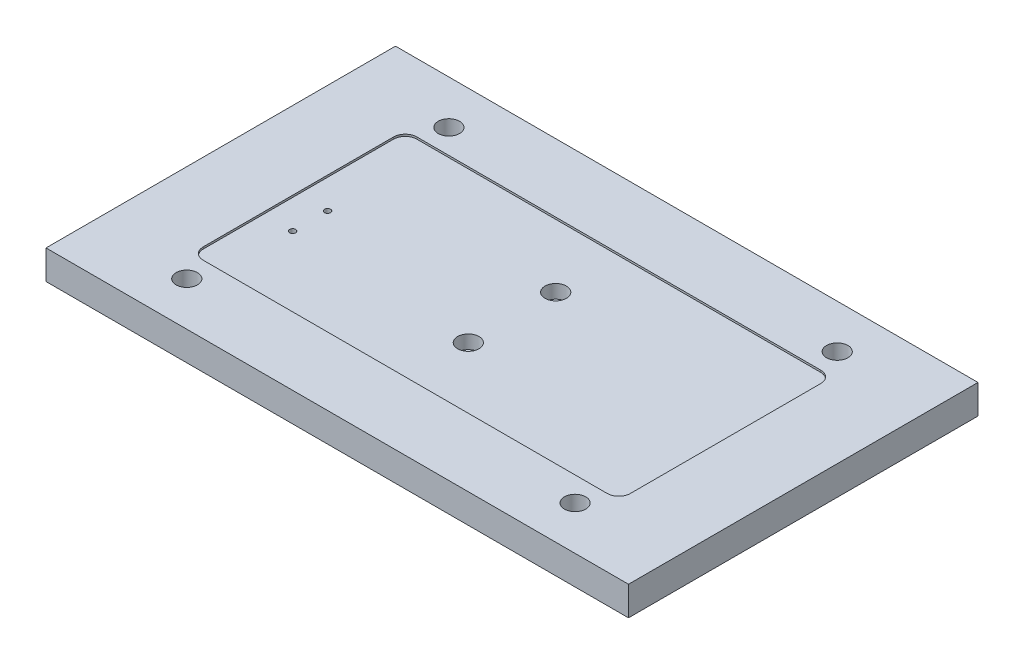
ISO-10303-21;
HEADER;
FILE_DESCRIPTION(('STEP AP214'),'2;1');
FILE_NAME('part.step','',(''),(''),'','','');
FILE_SCHEMA(('AUTOMOTIVE_DESIGN { 1 0 10303 214 1 1 1 1 }'));
ENDSEC;
DATA;
#1=APPLICATION_CONTEXT('core data for automotive mechanical design processes');
#2=APPLICATION_PROTOCOL_DEFINITION('international standard','automotive_design',2000,#1);
#3=PRODUCT_CONTEXT('',#1,'mechanical');
#4=PRODUCT('Part','Part','',(#3));
#5=PRODUCT_RELATED_PRODUCT_CATEGORY('part','',(#4));
#6=PRODUCT_DEFINITION_FORMATION('','',#4);
#7=PRODUCT_DEFINITION_CONTEXT('part definition',#1,'design');
#8=PRODUCT_DEFINITION('design','',#6,#7);
#9=PRODUCT_DEFINITION_SHAPE('','',#8);
#10=(LENGTH_UNIT() NAMED_UNIT(*) SI_UNIT(.MILLI.,.METRE.));
#11=(NAMED_UNIT(*) PLANE_ANGLE_UNIT() SI_UNIT($,.RADIAN.));
#12=(NAMED_UNIT(*) SI_UNIT($,.STERADIAN.) SOLID_ANGLE_UNIT());
#13=UNCERTAINTY_MEASURE_WITH_UNIT(LENGTH_MEASURE(1.E-05),#10,'distance_accuracy_value','');
#14=(GEOMETRIC_REPRESENTATION_CONTEXT(3) GLOBAL_UNCERTAINTY_ASSIGNED_CONTEXT((#13)) GLOBAL_UNIT_ASSIGNED_CONTEXT((#10,
#11,#12)) REPRESENTATION_CONTEXT('',''));
#15=CARTESIAN_POINT('',(0.,0.,0.));
#16=DIRECTION('',(0.,0.,1.));
#17=DIRECTION('',(1.,0.,0.));
#18=AXIS2_PLACEMENT_3D('',#15,#16,#17);
#19=CARTESIAN_POINT('',(0.,0.,22.5));
#20=DIRECTION('',(0.,1.,0.));
#21=DIRECTION('',(0.,0.,1.));
#22=AXIS2_PLACEMENT_3D('',#19,#20,#21);
#23=CYLINDRICAL_SURFACE('',#22,2.9999999999988);
#24=CARTESIAN_POINT('',(0.,0.,22.5));
#25=DIRECTION('',(0.,1.,0.));
#26=DIRECTION('',(0.,0.,1.));
#27=AXIS2_PLACEMENT_3D('',#24,#25,#26);
#28=CIRCLE('',#27,2.9999999999988);
#29=CARTESIAN_POINT('',(0.,0.,25.4999999999988));
#30=VERTEX_POINT('',#29);
#31=EDGE_CURVE('E286',#30,#30,#28,.T.);
#32=ORIENTED_EDGE('',*,*,#31,.F.);
#33=EDGE_LOOP('',(#32));
#34=FACE_BOUND('',#33,.T.);
#35=CARTESIAN_POINT('',(0.,7.,22.5));
#36=DIRECTION('',(0.,1.,0.));
#37=DIRECTION('',(0.,0.,1.));
#38=AXIS2_PLACEMENT_3D('',#35,#36,#37);
#39=CIRCLE('',#38,2.9999999999988);
#40=CARTESIAN_POINT('',(0.,7.,25.4999999999988));
#41=VERTEX_POINT('',#40);
#42=EDGE_CURVE('E248',#41,#41,#39,.F.);
#43=ORIENTED_EDGE('',*,*,#42,.F.);
#44=EDGE_LOOP('',(#43));
#45=FACE_BOUND('',#44,.T.);
#46=ADVANCED_FACE('F54',(#34,#45),#23,.F.);
#47=CARTESIAN_POINT('',(-99.9999999999996,0.,-67.4999999999996));
#48=DIRECTION('',(0.,1.,0.));
#49=DIRECTION('',(0.,0.,1.));
#50=AXIS2_PLACEMENT_3D('',#47,#48,#49);
#51=CYLINDRICAL_SURFACE('',#50,3.00000000000125);
#52=CARTESIAN_POINT('',(-99.9999999999996,0.,-67.4999999999996));
#53=DIRECTION('',(0.,1.,0.));
#54=DIRECTION('',(0.,0.,1.));
#55=AXIS2_PLACEMENT_3D('',#52,#53,#54);
#56=CIRCLE('',#55,3.00000000000125);
#57=CARTESIAN_POINT('',(-99.9999999999996,0.,-64.4999999999983));
#58=VERTEX_POINT('',#57);
#59=EDGE_CURVE('E279',#58,#58,#56,.T.);
#60=ORIENTED_EDGE('',*,*,#59,.F.);
#61=EDGE_LOOP('',(#60));
#62=FACE_BOUND('',#61,.T.);
#63=CARTESIAN_POINT('',(-99.9999999999996,7.,-67.4999999999996));
#64=DIRECTION('',(0.,1.,0.));
#65=DIRECTION('',(0.,0.,1.));
#66=AXIS2_PLACEMENT_3D('',#63,#64,#65);
#67=CIRCLE('',#66,3.00000000000125);
#68=CARTESIAN_POINT('',(-99.9999999999996,7.,-64.4999999999983));
#69=VERTEX_POINT('',#68);
#70=EDGE_CURVE('E267',#69,#69,#67,.F.);
#71=ORIENTED_EDGE('',*,*,#70,.F.);
#72=EDGE_LOOP('',(#71));
#73=FACE_BOUND('',#72,.T.);
#74=ADVANCED_FACE('F341',(#62,#73),#51,.F.);
#75=CARTESIAN_POINT('',(0.,0.,-22.5));
#76=DIRECTION('',(0.,1.,0.));
#77=DIRECTION('',(0.,0.,1.));
#78=AXIS2_PLACEMENT_3D('',#75,#76,#77);
#79=CYLINDRICAL_SURFACE('',#78,2.99999999999956);
#80=CARTESIAN_POINT('',(0.,0.,-22.5));
#81=DIRECTION('',(0.,1.,0.));
#82=DIRECTION('',(0.,0.,1.));
#83=AXIS2_PLACEMENT_3D('',#80,#81,#82);
#84=CIRCLE('',#83,2.99999999999956);
#85=CARTESIAN_POINT('',(0.,0.,-19.5000000000004));
#86=VERTEX_POINT('',#85);
#87=EDGE_CURVE('E282',#86,#86,#84,.T.);
#88=ORIENTED_EDGE('',*,*,#87,.F.);
#89=EDGE_LOOP('',(#88));
#90=FACE_BOUND('',#89,.T.);
#91=CARTESIAN_POINT('',(0.,7.,-22.5));
#92=DIRECTION('',(0.,1.,0.));
#93=DIRECTION('',(0.,0.,1.));
#94=AXIS2_PLACEMENT_3D('',#91,#92,#93);
#95=CIRCLE('',#94,2.99999999999956);
#96=CARTESIAN_POINT('',(0.,7.,-19.5000000000004));
#97=VERTEX_POINT('',#96);
#98=EDGE_CURVE('E261',#97,#97,#95,.F.);
#99=ORIENTED_EDGE('',*,*,#98,.F.);
#100=EDGE_LOOP('',(#99));
#101=FACE_BOUND('',#100,.T.);
#102=ADVANCED_FACE('F347',(#90,#101),#79,.F.);
#103=CARTESIAN_POINT('',(100.,0.,-67.5000000000004));
#104=DIRECTION('',(0.,1.,0.));
#105=DIRECTION('',(0.,0.,1.));
#106=AXIS2_PLACEMENT_3D('',#103,#104,#105);
#107=CYLINDRICAL_SURFACE('',#106,3.00000000000129);
#108=CARTESIAN_POINT('',(100.,0.,-67.5000000000004));
#109=DIRECTION('',(0.,1.,0.));
#110=DIRECTION('',(0.,0.,1.));
#111=AXIS2_PLACEMENT_3D('',#108,#109,#110);
#112=CIRCLE('',#111,3.00000000000129);
#113=CARTESIAN_POINT('',(100.,0.,-64.4999999999991));
#114=VERTEX_POINT('',#113);
#115=EDGE_CURVE('E290',#114,#114,#112,.T.);
#116=ORIENTED_EDGE('',*,*,#115,.F.);
#117=EDGE_LOOP('',(#116));
#118=FACE_BOUND('',#117,.T.);
#119=CARTESIAN_POINT('',(100.,7.,-67.5000000000004));
#120=DIRECTION('',(0.,1.,0.));
#121=DIRECTION('',(0.,0.,1.));
#122=AXIS2_PLACEMENT_3D('',#119,#120,#121);
#123=CIRCLE('',#122,3.00000000000129);
#124=CARTESIAN_POINT('',(100.,7.,-64.4999999999991));
#125=VERTEX_POINT('',#124);
#126=EDGE_CURVE('E235',#125,#125,#123,.F.);
#127=ORIENTED_EDGE('',*,*,#126,.F.);
#128=EDGE_LOOP('',(#127));
#129=FACE_BOUND('',#128,.T.);
#130=ADVANCED_FACE('F437',(#118,#129),#107,.F.);
#131=CARTESIAN_POINT('',(100.,0.,67.4999999999997));
#132=DIRECTION('',(0.,1.,0.));
#133=DIRECTION('',(0.,0.,1.));
#134=AXIS2_PLACEMENT_3D('',#131,#132,#133);
#135=CYLINDRICAL_SURFACE('',#134,3.00000000000102);
#136=CARTESIAN_POINT('',(100.,0.,67.4999999999997));
#137=DIRECTION('',(0.,1.,0.));
#138=DIRECTION('',(0.,0.,1.));
#139=AXIS2_PLACEMENT_3D('',#136,#137,#138);
#140=CIRCLE('',#139,3.00000000000102);
#141=CARTESIAN_POINT('',(100.,0.,70.5000000000007));
#142=VERTEX_POINT('',#141);
#143=EDGE_CURVE('E287',#142,#142,#140,.T.);
#144=ORIENTED_EDGE('',*,*,#143,.F.);
#145=EDGE_LOOP('',(#144));
#146=FACE_BOUND('',#145,.T.);
#147=CARTESIAN_POINT('',(100.,7.,67.4999999999997));
#148=DIRECTION('',(0.,1.,0.));
#149=DIRECTION('',(0.,0.,1.));
#150=AXIS2_PLACEMENT_3D('',#147,#148,#149);
#151=CIRCLE('',#150,3.00000000000102);
#152=CARTESIAN_POINT('',(100.,7.,70.5000000000007));
#153=VERTEX_POINT('',#152);
#154=EDGE_CURVE('E252',#153,#153,#151,.F.);
#155=ORIENTED_EDGE('',*,*,#154,.F.);
#156=EDGE_LOOP('',(#155));
#157=FACE_BOUND('',#156,.T.);
#158=ADVANCED_FACE('F434',(#146,#157),#135,.F.);
#159=CARTESIAN_POINT('',(-99.9999999999997,0.,67.5000000000003));
#160=DIRECTION('',(0.,1.,0.));
#161=DIRECTION('',(0.,0.,1.));
#162=AXIS2_PLACEMENT_3D('',#159,#160,#161);
#163=CYLINDRICAL_SURFACE('',#162,3.00000000000115);
#164=CARTESIAN_POINT('',(-99.9999999999997,0.,67.5000000000003));
#165=DIRECTION('',(0.,1.,0.));
#166=DIRECTION('',(0.,0.,1.));
#167=AXIS2_PLACEMENT_3D('',#164,#165,#166);
#168=CIRCLE('',#167,3.00000000000115);
#169=CARTESIAN_POINT('',(-99.9999999999997,0.,70.5000000000015));
#170=VERTEX_POINT('',#169);
#171=EDGE_CURVE('E283',#170,#170,#168,.T.);
#172=ORIENTED_EDGE('',*,*,#171,.F.);
#173=EDGE_LOOP('',(#172));
#174=FACE_BOUND('',#173,.T.);
#175=CARTESIAN_POINT('',(-99.9999999999997,7.,67.5000000000003));
#176=DIRECTION('',(0.,1.,0.));
#177=DIRECTION('',(0.,0.,1.));
#178=AXIS2_PLACEMENT_3D('',#175,#176,#177);
#179=CIRCLE('',#178,3.00000000000115);
#180=CARTESIAN_POINT('',(-99.9999999999997,7.,70.5000000000015));
#181=VERTEX_POINT('',#180);
#182=EDGE_CURVE('E241',#181,#181,#179,.F.);
#183=ORIENTED_EDGE('',*,*,#182,.F.);
#184=EDGE_LOOP('',(#183));
#185=FACE_BOUND('',#184,.T.);
#186=ADVANCED_FACE('F431',(#174,#185),#163,.F.);
#187=CARTESIAN_POINT('',(150.,15.,90.));
#188=DIRECTION('',(-1.,0.,0.));
#189=DIRECTION('',(0.,0.,1.));
#190=AXIS2_PLACEMENT_3D('',#187,#188,#189);
#191=PLANE('',#190);
#192=DIRECTION('',(0.,0.,-1.));
#193=VECTOR('',#192,1.);
#194=CARTESIAN_POINT('',(150.,0.,90.));
#195=LINE('',#194,#193);
#196=CARTESIAN_POINT('',(150.,0.,90.));
#197=VERTEX_POINT('',#196);
#198=CARTESIAN_POINT('',(150.,0.,-90.));
#199=VERTEX_POINT('',#198);
#200=EDGE_CURVE('E297',#197,#199,#195,.T.);
#201=ORIENTED_EDGE('',*,*,#200,.T.);
#202=DIRECTION('',(0.,-1.,0.));
#203=VECTOR('',#202,1.);
#204=CARTESIAN_POINT('',(150.,15.,-90.));
#205=LINE('',#204,#203);
#206=CARTESIAN_POINT('',(150.,15.,-90.));
#207=VERTEX_POINT('',#206);
#208=EDGE_CURVE('E12',#207,#199,#205,.T.);
#209=ORIENTED_EDGE('',*,*,#208,.F.);
#210=DIRECTION('',(0.,0.,-1.));
#211=VECTOR('',#210,1.);
#212=CARTESIAN_POINT('',(150.,15.,90.));
#213=LINE('',#212,#211);
#214=CARTESIAN_POINT('',(150.,15.,90.));
#215=VERTEX_POINT('',#214);
#216=EDGE_CURVE('E298',#215,#207,#213,.T.);
#217=ORIENTED_EDGE('',*,*,#216,.F.);
#218=DIRECTION('',(0.,-1.,0.));
#219=VECTOR('',#218,1.);
#220=CARTESIAN_POINT('',(150.,15.,90.));
#221=LINE('',#220,#219);
#222=EDGE_CURVE('E304',#215,#197,#221,.T.);
#223=ORIENTED_EDGE('',*,*,#222,.T.);
#224=EDGE_LOOP('',(#201,#209,#217,#223));
#225=FACE_BOUND('',#224,.T.);
#226=ADVANCED_FACE('F56',(#225),#191,.F.);
#227=CARTESIAN_POINT('',(-150.,15.,-90.));
#228=DIRECTION('',(0.,0.,1.));
#229=DIRECTION('',(1.,0.,0.));
#230=AXIS2_PLACEMENT_3D('',#227,#228,#229);
#231=PLANE('',#230);
#232=DIRECTION('',(-1.,0.,0.));
#233=VECTOR('',#232,1.);
#234=CARTESIAN_POINT('',(-150.,0.,-90.));
#235=LINE('',#234,#233);
#236=CARTESIAN_POINT('',(-150.,0.,-90.));
#237=VERTEX_POINT('',#236);
#238=EDGE_CURVE('E307',#199,#237,#235,.T.);
#239=ORIENTED_EDGE('',*,*,#238,.T.);
#240=DIRECTION('',(0.,-1.,0.));
#241=VECTOR('',#240,1.);
#242=CARTESIAN_POINT('',(-150.,15.,-90.));
#243=LINE('',#242,#241);
#244=CARTESIAN_POINT('',(-150.,15.,-90.));
#245=VERTEX_POINT('',#244);
#246=EDGE_CURVE('E63',#245,#237,#243,.T.);
#247=ORIENTED_EDGE('',*,*,#246,.F.);
#248=DIRECTION('',(-1.,0.,0.));
#249=VECTOR('',#248,1.);
#250=CARTESIAN_POINT('',(-150.,15.,-90.));
#251=LINE('',#250,#249);
#252=EDGE_CURVE('E107',#207,#245,#251,.T.);
#253=ORIENTED_EDGE('',*,*,#252,.F.);
#254=ORIENTED_EDGE('',*,*,#208,.T.);
#255=EDGE_LOOP('',(#239,#247,#253,#254));
#256=FACE_BOUND('',#255,.T.);
#257=ADVANCED_FACE('F337',(#256),#231,.F.);
#258=CARTESIAN_POINT('',(-150.,15.,90.));
#259=DIRECTION('',(1.,0.,0.));
#260=DIRECTION('',(0.,0.,-1.));
#261=AXIS2_PLACEMENT_3D('',#258,#259,#260);
#262=PLANE('',#261);
#263=DIRECTION('',(0.,0.,1.));
#264=VECTOR('',#263,1.);
#265=CARTESIAN_POINT('',(-150.,0.,90.));
#266=LINE('',#265,#264);
#267=CARTESIAN_POINT('',(-150.,0.,90.));
#268=VERTEX_POINT('',#267);
#269=EDGE_CURVE('E309',#237,#268,#266,.T.);
#270=ORIENTED_EDGE('',*,*,#269,.T.);
#271=DIRECTION('',(0.,-1.,0.));
#272=VECTOR('',#271,1.);
#273=CARTESIAN_POINT('',(-150.,15.,90.));
#274=LINE('',#273,#272);
#275=CARTESIAN_POINT('',(-150.,15.,90.));
#276=VERTEX_POINT('',#275);
#277=EDGE_CURVE('E313',#276,#268,#274,.T.);
#278=ORIENTED_EDGE('',*,*,#277,.F.);
#279=DIRECTION('',(0.,0.,1.));
#280=VECTOR('',#279,1.);
#281=CARTESIAN_POINT('',(-150.,15.,90.));
#282=LINE('',#281,#280);
#283=EDGE_CURVE('E301',#245,#276,#282,.T.);
#284=ORIENTED_EDGE('',*,*,#283,.F.);
#285=ORIENTED_EDGE('',*,*,#246,.T.);
#286=EDGE_LOOP('',(#270,#278,#284,#285));
#287=FACE_BOUND('',#286,.T.);
#288=ADVANCED_FACE('F319',(#287),#262,.F.);
#289=CARTESIAN_POINT('',(-150.,15.,90.));
#290=DIRECTION('',(0.,0.,-1.));
#291=DIRECTION('',(-1.,0.,0.));
#292=AXIS2_PLACEMENT_3D('',#289,#290,#291);
#293=PLANE('',#292);
#294=DIRECTION('',(1.,0.,0.));
#295=VECTOR('',#294,1.);
#296=CARTESIAN_POINT('',(-150.,0.,90.));
#297=LINE('',#296,#295);
#298=EDGE_CURVE('E100',#268,#197,#297,.T.);
#299=ORIENTED_EDGE('',*,*,#298,.T.);
#300=ORIENTED_EDGE('',*,*,#222,.F.);
#301=DIRECTION('',(1.,0.,0.));
#302=VECTOR('',#301,1.);
#303=CARTESIAN_POINT('',(-150.,15.,90.));
#304=LINE('',#303,#302);
#305=EDGE_CURVE('E79',#276,#215,#304,.T.);
#306=ORIENTED_EDGE('',*,*,#305,.F.);
#307=ORIENTED_EDGE('',*,*,#277,.T.);
#308=EDGE_LOOP('',(#299,#300,#306,#307));
#309=FACE_BOUND('',#308,.T.);
#310=ADVANCED_FACE('F327',(#309),#293,.F.);
#311=CARTESIAN_POINT('',(0.,15.,0.));
#312=DIRECTION('',(0.,-1.,0.));
#313=DIRECTION('',(0.,0.,-1.));
#314=AXIS2_PLACEMENT_3D('',#311,#312,#313);
#315=PLANE('',#314);
#316=DIRECTION('',(0.,0.,-1.));
#317=VECTOR('',#316,1.);
#318=CARTESIAN_POINT('',(110.,15.,49.));
#319=LINE('',#318,#317);
#320=CARTESIAN_POINT('',(110.,15.,49.));
#321=VERTEX_POINT('',#320);
#322=CARTESIAN_POINT('',(110.,15.,-49.));
#323=VERTEX_POINT('',#322);
#324=EDGE_CURVE('E198',#321,#323,#319,.T.);
#325=ORIENTED_EDGE('',*,*,#324,.F.);
#326=CARTESIAN_POINT('',(104.,15.,49.));
#327=DIRECTION('',(0.,1.,0.));
#328=DIRECTION('',(0.,0.,-1.));
#329=AXIS2_PLACEMENT_3D('',#326,#327,#328);
#330=CIRCLE('',#329,6.);
#331=CARTESIAN_POINT('',(104.,15.,55.));
#332=VERTEX_POINT('',#331);
#333=EDGE_CURVE('E70',#332,#321,#330,.T.);
#334=ORIENTED_EDGE('',*,*,#333,.F.);
#335=DIRECTION('',(1.,0.,0.));
#336=VECTOR('',#335,1.);
#337=CARTESIAN_POINT('',(-104.,15.,55.));
#338=LINE('',#337,#336);
#339=CARTESIAN_POINT('',(-104.,15.,55.));
#340=VERTEX_POINT('',#339);
#341=EDGE_CURVE('E175',#340,#332,#338,.T.);
#342=ORIENTED_EDGE('',*,*,#341,.F.);
#343=CARTESIAN_POINT('',(-104.,15.,49.));
#344=DIRECTION('',(0.,1.,0.));
#345=DIRECTION('',(0.,0.,1.));
#346=AXIS2_PLACEMENT_3D('',#343,#344,#345);
#347=CIRCLE('',#346,6.00000000000001);
#348=CARTESIAN_POINT('',(-110.,15.,49.));
#349=VERTEX_POINT('',#348);
#350=EDGE_CURVE('E178',#349,#340,#347,.T.);
#351=ORIENTED_EDGE('',*,*,#350,.F.);
#352=DIRECTION('',(0.,0.,1.));
#353=VECTOR('',#352,1.);
#354=CARTESIAN_POINT('',(-110.,15.,49.));
#355=LINE('',#354,#353);
#356=CARTESIAN_POINT('',(-110.,15.,-49.));
#357=VERTEX_POINT('',#356);
#358=EDGE_CURVE('E210',#357,#349,#355,.T.);
#359=ORIENTED_EDGE('',*,*,#358,.F.);
#360=CARTESIAN_POINT('',(-104.,15.,-49.));
#361=DIRECTION('',(0.,1.,0.));
#362=DIRECTION('',(0.,0.,1.));
#363=AXIS2_PLACEMENT_3D('',#360,#361,#362);
#364=CIRCLE('',#363,5.99999999999999);
#365=CARTESIAN_POINT('',(-104.,15.,-55.));
#366=VERTEX_POINT('',#365);
#367=EDGE_CURVE('E207',#366,#357,#364,.T.);
#368=ORIENTED_EDGE('',*,*,#367,.F.);
#369=DIRECTION('',(-1.,0.,0.));
#370=VECTOR('',#369,1.);
#371=CARTESIAN_POINT('',(-104.,15.,-55.));
#372=LINE('',#371,#370);
#373=CARTESIAN_POINT('',(104.,15.,-55.));
#374=VERTEX_POINT('',#373);
#375=EDGE_CURVE('E204',#374,#366,#372,.T.);
#376=ORIENTED_EDGE('',*,*,#375,.F.);
#377=CARTESIAN_POINT('',(104.,15.,-49.));
#378=DIRECTION('',(0.,1.,0.));
#379=DIRECTION('',(0.,0.,1.));
#380=AXIS2_PLACEMENT_3D('',#377,#378,#379);
#381=CIRCLE('',#380,6.);
#382=EDGE_CURVE('E201',#323,#374,#381,.T.);
#383=ORIENTED_EDGE('',*,*,#382,.F.);
#384=EDGE_LOOP('',(#325,#334,#342,#351,#359,#368,#376,#383));
#385=FACE_BOUND('',#384,.T.);
#386=CARTESIAN_POINT('',(-100.,15.,67.5));
#387=DIRECTION('',(0.,1.,0.));
#388=DIRECTION('',(0.,0.,1.));
#389=AXIS2_PLACEMENT_3D('',#386,#387,#388);
#390=CIRCLE('',#389,5.50000000000001);
#391=CARTESIAN_POINT('',(-100.,15.,73.));
#392=VERTEX_POINT('',#391);
#393=EDGE_CURVE('E245',#392,#392,#390,.T.);
#394=ORIENTED_EDGE('',*,*,#393,.F.);
#395=EDGE_LOOP('',(#394));
#396=FACE_BOUND('',#395,.T.);
#397=CARTESIAN_POINT('',(100.,15.,67.5));
#398=DIRECTION('',(0.,1.,0.));
#399=DIRECTION('',(0.,0.,1.));
#400=AXIS2_PLACEMENT_3D('',#397,#398,#399);
#401=CIRCLE('',#400,5.50000000000001);
#402=CARTESIAN_POINT('',(100.,15.,73.));
#403=VERTEX_POINT('',#402);
#404=EDGE_CURVE('E255',#403,#403,#401,.T.);
#405=ORIENTED_EDGE('',*,*,#404,.F.);
#406=EDGE_LOOP('',(#405));
#407=FACE_BOUND('',#406,.T.);
#408=CARTESIAN_POINT('',(-100.,15.,-67.5));
#409=DIRECTION('',(0.,1.,0.));
#410=DIRECTION('',(0.,0.,1.));
#411=AXIS2_PLACEMENT_3D('',#408,#409,#410);
#412=CIRCLE('',#411,5.50000000000001);
#413=CARTESIAN_POINT('',(-100.,15.,-62.));
#414=VERTEX_POINT('',#413);
#415=EDGE_CURVE('E238',#414,#414,#412,.T.);
#416=ORIENTED_EDGE('',*,*,#415,.F.);
#417=EDGE_LOOP('',(#416));
#418=FACE_BOUND('',#417,.T.);
#419=CARTESIAN_POINT('',(100.,15.,-67.5));
#420=DIRECTION('',(0.,1.,0.));
#421=DIRECTION('',(0.,0.,1.));
#422=AXIS2_PLACEMENT_3D('',#419,#420,#421);
#423=CIRCLE('',#422,5.50000000000001);
#424=CARTESIAN_POINT('',(100.,15.,-62.));
#425=VERTEX_POINT('',#424);
#426=EDGE_CURVE('E231',#425,#425,#423,.T.);
#427=ORIENTED_EDGE('',*,*,#426,.F.);
#428=EDGE_LOOP('',(#427));
#429=FACE_BOUND('',#428,.T.);
#430=ORIENTED_EDGE('',*,*,#216,.T.);
#431=ORIENTED_EDGE('',*,*,#252,.T.);
#432=ORIENTED_EDGE('',*,*,#283,.T.);
#433=ORIENTED_EDGE('',*,*,#305,.T.);
#434=EDGE_LOOP('',(#430,#431,#432,#433));
#435=FACE_BOUND('',#434,.T.);
#436=ADVANCED_FACE('F329',(#385,#396,#407,#418,#429,#435),#315,.F.);
#437=CARTESIAN_POINT('',(0.,0.,0.));
#438=DIRECTION('',(0.,-1.,0.));
#439=DIRECTION('',(0.,0.,-1.));
#440=AXIS2_PLACEMENT_3D('',#437,#438,#439);
#441=PLANE('',#440);
#442=ORIENTED_EDGE('',*,*,#171,.T.);
#443=EDGE_LOOP('',(#442));
#444=FACE_BOUND('',#443,.T.);
#445=ORIENTED_EDGE('',*,*,#143,.T.);
#446=EDGE_LOOP('',(#445));
#447=FACE_BOUND('',#446,.T.);
#448=ORIENTED_EDGE('',*,*,#115,.T.);
#449=EDGE_LOOP('',(#448));
#450=FACE_BOUND('',#449,.T.);
#451=ORIENTED_EDGE('',*,*,#87,.T.);
#452=EDGE_LOOP('',(#451));
#453=FACE_BOUND('',#452,.T.);
#454=ORIENTED_EDGE('',*,*,#59,.T.);
#455=EDGE_LOOP('',(#454));
#456=FACE_BOUND('',#455,.T.);
#457=ORIENTED_EDGE('',*,*,#31,.T.);
#458=EDGE_LOOP('',(#457));
#459=FACE_BOUND('',#458,.T.);
#460=ORIENTED_EDGE('',*,*,#200,.F.);
#461=ORIENTED_EDGE('',*,*,#298,.F.);
#462=ORIENTED_EDGE('',*,*,#269,.F.);
#463=ORIENTED_EDGE('',*,*,#238,.F.);
#464=EDGE_LOOP('',(#460,#461,#462,#463));
#465=FACE_BOUND('',#464,.T.);
#466=ADVANCED_FACE('F323',(#444,#447,#450,#453,#456,#459,#465),#441,.T.);
#467=CARTESIAN_POINT('',(-100.,7.,67.5));
#468=DIRECTION('',(0.,1.,0.));
#469=DIRECTION('',(0.,0.,1.));
#470=AXIS2_PLACEMENT_3D('',#467,#468,#469);
#471=CYLINDRICAL_SURFACE('',#470,5.50000000000001);
#472=CARTESIAN_POINT('',(-100.,7.,67.5));
#473=DIRECTION('',(0.,1.,0.));
#474=DIRECTION('',(0.,0.,1.));
#475=AXIS2_PLACEMENT_3D('',#472,#473,#474);
#476=CIRCLE('',#475,5.50000000000001);
#477=CARTESIAN_POINT('',(-100.,7.,73.));
#478=VERTEX_POINT('',#477);
#479=EDGE_CURVE('E244',#478,#478,#476,.T.);
#480=ORIENTED_EDGE('',*,*,#479,.F.);
#481=EDGE_LOOP('',(#480));
#482=FACE_BOUND('',#481,.T.);
#483=ORIENTED_EDGE('',*,*,#393,.T.);
#484=EDGE_LOOP('',(#483));
#485=FACE_BOUND('',#484,.T.);
#486=ADVANCED_FACE('F355',(#482,#485),#471,.F.);
#487=CARTESIAN_POINT('',(0.,7.,0.));
#488=DIRECTION('',(0.,1.,0.));
#489=DIRECTION('',(0.,0.,1.));
#490=AXIS2_PLACEMENT_3D('',#487,#488,#489);
#491=PLANE('',#490);
#492=ORIENTED_EDGE('',*,*,#182,.T.);
#493=EDGE_LOOP('',(#492));
#494=FACE_BOUND('',#493,.T.);
#495=ORIENTED_EDGE('',*,*,#479,.T.);
#496=EDGE_LOOP('',(#495));
#497=FACE_BOUND('',#496,.T.);
#498=ADVANCED_FACE('F360',(#494,#497),#491,.T.);
#499=CARTESIAN_POINT('',(100.,7.,67.5));
#500=DIRECTION('',(0.,1.,0.));
#501=DIRECTION('',(0.,0.,1.));
#502=AXIS2_PLACEMENT_3D('',#499,#500,#501);
#503=CYLINDRICAL_SURFACE('',#502,5.50000000000001);
#504=CARTESIAN_POINT('',(100.,7.,67.5));
#505=DIRECTION('',(0.,1.,0.));
#506=DIRECTION('',(0.,0.,1.));
#507=AXIS2_PLACEMENT_3D('',#504,#505,#506);
#508=CIRCLE('',#507,5.50000000000001);
#509=CARTESIAN_POINT('',(100.,7.,73.));
#510=VERTEX_POINT('',#509);
#511=EDGE_CURVE('E251',#510,#510,#508,.T.);
#512=ORIENTED_EDGE('',*,*,#511,.F.);
#513=EDGE_LOOP('',(#512));
#514=FACE_BOUND('',#513,.T.);
#515=ORIENTED_EDGE('',*,*,#404,.T.);
#516=EDGE_LOOP('',(#515));
#517=FACE_BOUND('',#516,.T.);
#518=ADVANCED_FACE('F406',(#514,#517),#503,.F.);
#519=CARTESIAN_POINT('',(0.,7.,0.));
#520=DIRECTION('',(0.,1.,0.));
#521=DIRECTION('',(0.,0.,1.));
#522=AXIS2_PLACEMENT_3D('',#519,#520,#521);
#523=PLANE('',#522);
#524=ORIENTED_EDGE('',*,*,#154,.T.);
#525=EDGE_LOOP('',(#524));
#526=FACE_BOUND('',#525,.T.);
#527=ORIENTED_EDGE('',*,*,#511,.T.);
#528=EDGE_LOOP('',(#527));
#529=FACE_BOUND('',#528,.T.);
#530=ADVANCED_FACE('F396',(#526,#529),#523,.T.);
#531=CARTESIAN_POINT('',(100.,7.,-67.5));
#532=DIRECTION('',(0.,1.,0.));
#533=DIRECTION('',(0.,0.,1.));
#534=AXIS2_PLACEMENT_3D('',#531,#532,#533);
#535=CYLINDRICAL_SURFACE('',#534,5.50000000000001);
#536=CARTESIAN_POINT('',(100.,7.,-67.5));
#537=DIRECTION('',(0.,1.,0.));
#538=DIRECTION('',(0.,0.,1.));
#539=AXIS2_PLACEMENT_3D('',#536,#537,#538);
#540=CIRCLE('',#539,5.50000000000001);
#541=CARTESIAN_POINT('',(100.,7.,-62.));
#542=VERTEX_POINT('',#541);
#543=EDGE_CURVE('E232',#542,#542,#540,.T.);
#544=ORIENTED_EDGE('',*,*,#543,.F.);
#545=EDGE_LOOP('',(#544));
#546=FACE_BOUND('',#545,.T.);
#547=ORIENTED_EDGE('',*,*,#426,.T.);
#548=EDGE_LOOP('',(#547));
#549=FACE_BOUND('',#548,.T.);
#550=ADVANCED_FACE('F393',(#546,#549),#535,.F.);
#551=CARTESIAN_POINT('',(0.,7.,0.));
#552=DIRECTION('',(0.,1.,0.));
#553=DIRECTION('',(0.,0.,1.));
#554=AXIS2_PLACEMENT_3D('',#551,#552,#553);
#555=PLANE('',#554);
#556=ORIENTED_EDGE('',*,*,#543,.T.);
#557=EDGE_LOOP('',(#556));
#558=FACE_BOUND('',#557,.T.);
#559=ORIENTED_EDGE('',*,*,#126,.T.);
#560=EDGE_LOOP('',(#559));
#561=FACE_BOUND('',#560,.T.);
#562=ADVANCED_FACE('F395',(#558,#561),#555,.T.);
#563=CARTESIAN_POINT('',(0.,7.,-22.5));
#564=DIRECTION('',(0.,1.,0.));
#565=DIRECTION('',(0.,0.,1.));
#566=AXIS2_PLACEMENT_3D('',#563,#564,#565);
#567=CYLINDRICAL_SURFACE('',#566,5.5);
#568=CARTESIAN_POINT('',(0.,14.,-22.5));
#569=DIRECTION('',(0.,-1.,0.));
#570=DIRECTION('',(0.,0.,-1.));
#571=AXIS2_PLACEMENT_3D('',#568,#569,#570);
#572=CIRCLE('',#571,5.5);
#573=CARTESIAN_POINT('',(0.,14.,-28.));
#574=VERTEX_POINT('',#573);
#575=EDGE_CURVE('E228',#574,#574,#572,.F.);
#576=ORIENTED_EDGE('',*,*,#575,.T.);
#577=EDGE_LOOP('',(#576));
#578=FACE_BOUND('',#577,.T.);
#579=CARTESIAN_POINT('',(0.,7.,-22.5));
#580=DIRECTION('',(0.,1.,0.));
#581=DIRECTION('',(0.,0.,1.));
#582=AXIS2_PLACEMENT_3D('',#579,#580,#581);
#583=CIRCLE('',#582,5.5);
#584=CARTESIAN_POINT('',(0.,7.,-17.));
#585=VERTEX_POINT('',#584);
#586=EDGE_CURVE('E260',#585,#585,#583,.T.);
#587=ORIENTED_EDGE('',*,*,#586,.F.);
#588=EDGE_LOOP('',(#587));
#589=FACE_BOUND('',#588,.T.);
#590=ADVANCED_FACE('F403',(#578,#589),#567,.F.);
#591=CARTESIAN_POINT('',(0.,7.,0.));
#592=DIRECTION('',(0.,1.,0.));
#593=DIRECTION('',(0.,0.,1.));
#594=AXIS2_PLACEMENT_3D('',#591,#592,#593);
#595=PLANE('',#594);
#596=ORIENTED_EDGE('',*,*,#98,.T.);
#597=EDGE_LOOP('',(#596));
#598=FACE_BOUND('',#597,.T.);
#599=ORIENTED_EDGE('',*,*,#586,.T.);
#600=EDGE_LOOP('',(#599));
#601=FACE_BOUND('',#600,.T.);
#602=ADVANCED_FACE('F386',(#598,#601),#595,.T.);
#603=CARTESIAN_POINT('',(-100.,7.,-67.5));
#604=DIRECTION('',(0.,1.,0.));
#605=DIRECTION('',(0.,0.,1.));
#606=AXIS2_PLACEMENT_3D('',#603,#604,#605);
#607=CYLINDRICAL_SURFACE('',#606,5.50000000000001);
#608=CARTESIAN_POINT('',(-100.,7.,-67.5));
#609=DIRECTION('',(0.,1.,0.));
#610=DIRECTION('',(0.,0.,1.));
#611=AXIS2_PLACEMENT_3D('',#608,#609,#610);
#612=CIRCLE('',#611,5.50000000000001);
#613=CARTESIAN_POINT('',(-100.,7.,-62.));
#614=VERTEX_POINT('',#613);
#615=EDGE_CURVE('E264',#614,#614,#612,.T.);
#616=ORIENTED_EDGE('',*,*,#615,.F.);
#617=EDGE_LOOP('',(#616));
#618=FACE_BOUND('',#617,.T.);
#619=ORIENTED_EDGE('',*,*,#415,.T.);
#620=EDGE_LOOP('',(#619));
#621=FACE_BOUND('',#620,.T.);
#622=ADVANCED_FACE('F380',(#618,#621),#607,.F.);
#623=CARTESIAN_POINT('',(0.,7.,0.));
#624=DIRECTION('',(0.,1.,0.));
#625=DIRECTION('',(0.,0.,1.));
#626=AXIS2_PLACEMENT_3D('',#623,#624,#625);
#627=PLANE('',#626);
#628=ORIENTED_EDGE('',*,*,#70,.T.);
#629=EDGE_LOOP('',(#628));
#630=FACE_BOUND('',#629,.T.);
#631=ORIENTED_EDGE('',*,*,#615,.T.);
#632=EDGE_LOOP('',(#631));
#633=FACE_BOUND('',#632,.T.);
#634=ADVANCED_FACE('F376',(#630,#633),#627,.T.);
#635=CARTESIAN_POINT('',(0.,7.,22.5));
#636=DIRECTION('',(0.,1.,0.));
#637=DIRECTION('',(0.,0.,1.));
#638=AXIS2_PLACEMENT_3D('',#635,#636,#637);
#639=CYLINDRICAL_SURFACE('',#638,5.5);
#640=CARTESIAN_POINT('',(0.,14.,22.5));
#641=DIRECTION('',(0.,-1.,0.));
#642=DIRECTION('',(0.,0.,-1.));
#643=AXIS2_PLACEMENT_3D('',#640,#641,#642);
#644=CIRCLE('',#643,5.5);
#645=CARTESIAN_POINT('',(0.,14.,17.));
#646=VERTEX_POINT('',#645);
#647=EDGE_CURVE('E58',#646,#646,#644,.F.);
#648=ORIENTED_EDGE('',*,*,#647,.T.);
#649=EDGE_LOOP('',(#648));
#650=FACE_BOUND('',#649,.T.);
#651=CARTESIAN_POINT('',(0.,7.,22.5));
#652=DIRECTION('',(0.,1.,0.));
#653=DIRECTION('',(0.,0.,1.));
#654=AXIS2_PLACEMENT_3D('',#651,#652,#653);
#655=CIRCLE('',#654,5.5);
#656=CARTESIAN_POINT('',(0.,7.,28.));
#657=VERTEX_POINT('',#656);
#658=EDGE_CURVE('E276',#657,#657,#655,.T.);
#659=ORIENTED_EDGE('',*,*,#658,.F.);
#660=EDGE_LOOP('',(#659));
#661=FACE_BOUND('',#660,.T.);
#662=ADVANCED_FACE('F379',(#650,#661),#639,.F.);
#663=CARTESIAN_POINT('',(0.,7.,0.));
#664=DIRECTION('',(0.,1.,0.));
#665=DIRECTION('',(0.,0.,1.));
#666=AXIS2_PLACEMENT_3D('',#663,#664,#665);
#667=PLANE('',#666);
#668=ORIENTED_EDGE('',*,*,#42,.T.);
#669=EDGE_LOOP('',(#668));
#670=FACE_BOUND('',#669,.T.);
#671=ORIENTED_EDGE('',*,*,#658,.T.);
#672=EDGE_LOOP('',(#671));
#673=FACE_BOUND('',#672,.T.);
#674=ADVANCED_FACE('F424',(#670,#673),#667,.T.);
#675=CARTESIAN_POINT('',(104.,14.,49.));
#676=DIRECTION('',(0.,-1.,0.));
#677=DIRECTION('',(0.,0.,-1.));
#678=AXIS2_PLACEMENT_3D('',#675,#676,#677);
#679=PLANE('',#678);
#680=CARTESIAN_POINT('',(-95.,14.,18.));
#681=DIRECTION('',(0.,1.,0.));
#682=DIRECTION('',(0.,0.,1.));
#683=AXIS2_PLACEMENT_3D('',#680,#681,#682);
#684=CIRCLE('',#683,1.54999999999999);
#685=CARTESIAN_POINT('',(-95.,14.,19.55));
#686=VERTEX_POINT('',#685);
#687=EDGE_CURVE('E722',#686,#686,#684,.T.);
#688=ORIENTED_EDGE('',*,*,#687,.F.);
#689=EDGE_LOOP('',(#688));
#690=FACE_BOUND('',#689,.T.);
#691=CARTESIAN_POINT('',(-95.,14.,0.));
#692=DIRECTION('',(0.,1.,0.));
#693=DIRECTION('',(0.,0.,1.));
#694=AXIS2_PLACEMENT_3D('',#691,#692,#693);
#695=CIRCLE('',#694,1.54999999999999);
#696=CARTESIAN_POINT('',(-95.,14.,1.55));
#697=VERTEX_POINT('',#696);
#698=EDGE_CURVE('E726',#697,#697,#695,.T.);
#699=ORIENTED_EDGE('',*,*,#698,.F.);
#700=EDGE_LOOP('',(#699));
#701=FACE_BOUND('',#700,.T.);
#702=ORIENTED_EDGE('',*,*,#647,.F.);
#703=EDGE_LOOP('',(#702));
#704=FACE_BOUND('',#703,.T.);
#705=CARTESIAN_POINT('',(104.,14.,49.));
#706=DIRECTION('',(0.,1.,0.));
#707=DIRECTION('',(0.,0.,-1.));
#708=AXIS2_PLACEMENT_3D('',#705,#706,#707);
#709=CIRCLE('',#708,6.);
#710=CARTESIAN_POINT('',(104.,14.,55.));
#711=VERTEX_POINT('',#710);
#712=CARTESIAN_POINT('',(110.,14.,49.));
#713=VERTEX_POINT('',#712);
#714=EDGE_CURVE('E155',#711,#713,#709,.T.);
#715=ORIENTED_EDGE('',*,*,#714,.T.);
#716=DIRECTION('',(0.,0.,-1.));
#717=VECTOR('',#716,1.);
#718=CARTESIAN_POINT('',(110.,14.,49.));
#719=LINE('',#718,#717);
#720=CARTESIAN_POINT('',(110.,14.,-49.));
#721=VERTEX_POINT('',#720);
#722=EDGE_CURVE('E164',#713,#721,#719,.T.);
#723=ORIENTED_EDGE('',*,*,#722,.T.);
#724=CARTESIAN_POINT('',(104.,14.,-49.));
#725=DIRECTION('',(0.,1.,0.));
#726=DIRECTION('',(0.,0.,1.));
#727=AXIS2_PLACEMENT_3D('',#724,#725,#726);
#728=CIRCLE('',#727,6.);
#729=CARTESIAN_POINT('',(104.,14.,-55.));
#730=VERTEX_POINT('',#729);
#731=EDGE_CURVE('E169',#721,#730,#728,.T.);
#732=ORIENTED_EDGE('',*,*,#731,.T.);
#733=DIRECTION('',(-1.,0.,0.));
#734=VECTOR('',#733,1.);
#735=CARTESIAN_POINT('',(-104.,14.,-55.));
#736=LINE('',#735,#734);
#737=CARTESIAN_POINT('',(-104.,14.,-55.));
#738=VERTEX_POINT('',#737);
#739=EDGE_CURVE('E185',#730,#738,#736,.T.);
#740=ORIENTED_EDGE('',*,*,#739,.T.);
#741=CARTESIAN_POINT('',(-104.,14.,-49.));
#742=DIRECTION('',(0.,1.,0.));
#743=DIRECTION('',(0.,0.,1.));
#744=AXIS2_PLACEMENT_3D('',#741,#742,#743);
#745=CIRCLE('',#744,5.99999999999999);
#746=CARTESIAN_POINT('',(-110.,14.,-49.));
#747=VERTEX_POINT('',#746);
#748=EDGE_CURVE('E188',#738,#747,#745,.T.);
#749=ORIENTED_EDGE('',*,*,#748,.T.);
#750=DIRECTION('',(0.,0.,1.));
#751=VECTOR('',#750,1.);
#752=CARTESIAN_POINT('',(-110.,14.,49.));
#753=LINE('',#752,#751);
#754=CARTESIAN_POINT('',(-110.,14.,49.));
#755=VERTEX_POINT('',#754);
#756=EDGE_CURVE('E191',#747,#755,#753,.T.);
#757=ORIENTED_EDGE('',*,*,#756,.T.);
#758=CARTESIAN_POINT('',(-104.,14.,49.));
#759=DIRECTION('',(0.,1.,0.));
#760=DIRECTION('',(0.,0.,1.));
#761=AXIS2_PLACEMENT_3D('',#758,#759,#760);
#762=CIRCLE('',#761,6.00000000000001);
#763=CARTESIAN_POINT('',(-104.,14.,55.));
#764=VERTEX_POINT('',#763);
#765=EDGE_CURVE('E194',#755,#764,#762,.T.);
#766=ORIENTED_EDGE('',*,*,#765,.T.);
#767=DIRECTION('',(1.,0.,0.));
#768=VECTOR('',#767,1.);
#769=CARTESIAN_POINT('',(-104.,14.,55.));
#770=LINE('',#769,#768);
#771=EDGE_CURVE('E161',#764,#711,#770,.T.);
#772=ORIENTED_EDGE('',*,*,#771,.T.);
#773=EDGE_LOOP('',(#715,#723,#732,#740,#749,#757,#766,#772));
#774=FACE_BOUND('',#773,.T.);
#775=ORIENTED_EDGE('',*,*,#575,.F.);
#776=EDGE_LOOP('',(#775));
#777=FACE_BOUND('',#776,.T.);
#778=ADVANCED_FACE('F171',(#690,#701,#704,#774,#777),#679,.F.);
#779=CARTESIAN_POINT('',(104.,14.,49.));
#780=DIRECTION('',(0.,1.,0.));
#781=DIRECTION('',(0.,0.,1.));
#782=AXIS2_PLACEMENT_3D('',#779,#780,#781);
#783=CYLINDRICAL_SURFACE('',#782,6.);
#784=ORIENTED_EDGE('',*,*,#333,.T.);
#785=DIRECTION('',(0.,1.,0.));
#786=VECTOR('',#785,1.);
#787=CARTESIAN_POINT('',(110.,14.,49.));
#788=LINE('',#787,#786);
#789=EDGE_CURVE('E151',#713,#321,#788,.T.);
#790=ORIENTED_EDGE('',*,*,#789,.F.);
#791=ORIENTED_EDGE('',*,*,#714,.F.);
#792=DIRECTION('',(0.,1.,0.));
#793=VECTOR('',#792,1.);
#794=CARTESIAN_POINT('',(104.,14.,55.));
#795=LINE('',#794,#793);
#796=EDGE_CURVE('E215',#711,#332,#795,.T.);
#797=ORIENTED_EDGE('',*,*,#796,.T.);
#798=EDGE_LOOP('',(#784,#790,#791,#797));
#799=FACE_BOUND('',#798,.T.);
#800=ADVANCED_FACE('F153',(#799),#783,.F.);
#801=CARTESIAN_POINT('',(-104.,14.,55.));
#802=DIRECTION('',(0.,0.,1.));
#803=DIRECTION('',(1.,0.,0.));
#804=AXIS2_PLACEMENT_3D('',#801,#802,#803);
#805=PLANE('',#804);
#806=ORIENTED_EDGE('',*,*,#341,.T.);
#807=ORIENTED_EDGE('',*,*,#796,.F.);
#808=ORIENTED_EDGE('',*,*,#771,.F.);
#809=DIRECTION('',(0.,1.,0.));
#810=VECTOR('',#809,1.);
#811=CARTESIAN_POINT('',(-104.,14.,55.));
#812=LINE('',#811,#810);
#813=EDGE_CURVE('E217',#764,#340,#812,.T.);
#814=ORIENTED_EDGE('',*,*,#813,.T.);
#815=EDGE_LOOP('',(#806,#807,#808,#814));
#816=FACE_BOUND('',#815,.T.);
#817=ADVANCED_FACE('F603',(#816),#805,.F.);
#818=CARTESIAN_POINT('',(-104.,14.,49.));
#819=DIRECTION('',(0.,1.,0.));
#820=DIRECTION('',(0.,0.,1.));
#821=AXIS2_PLACEMENT_3D('',#818,#819,#820);
#822=CYLINDRICAL_SURFACE('',#821,6.00000000000001);
#823=ORIENTED_EDGE('',*,*,#350,.T.);
#824=ORIENTED_EDGE('',*,*,#813,.F.);
#825=ORIENTED_EDGE('',*,*,#765,.F.);
#826=DIRECTION('',(0.,1.,0.));
#827=VECTOR('',#826,1.);
#828=CARTESIAN_POINT('',(-110.,14.,49.));
#829=LINE('',#828,#827);
#830=EDGE_CURVE('E219',#755,#349,#829,.T.);
#831=ORIENTED_EDGE('',*,*,#830,.T.);
#832=EDGE_LOOP('',(#823,#824,#825,#831));
#833=FACE_BOUND('',#832,.T.);
#834=ADVANCED_FACE('F611',(#833),#822,.F.);
#835=CARTESIAN_POINT('',(-110.,14.,49.));
#836=DIRECTION('',(-1.,0.,0.));
#837=DIRECTION('',(0.,0.,1.));
#838=AXIS2_PLACEMENT_3D('',#835,#836,#837);
#839=PLANE('',#838);
#840=ORIENTED_EDGE('',*,*,#358,.T.);
#841=ORIENTED_EDGE('',*,*,#830,.F.);
#842=ORIENTED_EDGE('',*,*,#756,.F.);
#843=DIRECTION('',(0.,1.,0.));
#844=VECTOR('',#843,1.);
#845=CARTESIAN_POINT('',(-110.,14.,-49.));
#846=LINE('',#845,#844);
#847=EDGE_CURVE('E221',#747,#357,#846,.T.);
#848=ORIENTED_EDGE('',*,*,#847,.T.);
#849=EDGE_LOOP('',(#840,#841,#842,#848));
#850=FACE_BOUND('',#849,.T.);
#851=ADVANCED_FACE('F621',(#850),#839,.F.);
#852=CARTESIAN_POINT('',(-104.,14.,-49.));
#853=DIRECTION('',(0.,1.,0.));
#854=DIRECTION('',(0.,0.,1.));
#855=AXIS2_PLACEMENT_3D('',#852,#853,#854);
#856=CYLINDRICAL_SURFACE('',#855,5.99999999999999);
#857=ORIENTED_EDGE('',*,*,#367,.T.);
#858=ORIENTED_EDGE('',*,*,#847,.F.);
#859=ORIENTED_EDGE('',*,*,#748,.F.);
#860=DIRECTION('',(0.,1.,0.));
#861=VECTOR('',#860,1.);
#862=CARTESIAN_POINT('',(-104.,14.,-55.));
#863=LINE('',#862,#861);
#864=EDGE_CURVE('E223',#738,#366,#863,.T.);
#865=ORIENTED_EDGE('',*,*,#864,.T.);
#866=EDGE_LOOP('',(#857,#858,#859,#865));
#867=FACE_BOUND('',#866,.T.);
#868=ADVANCED_FACE('F631',(#867),#856,.F.);
#869=CARTESIAN_POINT('',(-104.,14.,-55.));
#870=DIRECTION('',(0.,0.,-1.));
#871=DIRECTION('',(-1.,0.,0.));
#872=AXIS2_PLACEMENT_3D('',#869,#870,#871);
#873=PLANE('',#872);
#874=ORIENTED_EDGE('',*,*,#375,.T.);
#875=ORIENTED_EDGE('',*,*,#864,.F.);
#876=ORIENTED_EDGE('',*,*,#739,.F.);
#877=DIRECTION('',(0.,1.,0.));
#878=VECTOR('',#877,1.);
#879=CARTESIAN_POINT('',(104.,14.,-55.));
#880=LINE('',#879,#878);
#881=EDGE_CURVE('E225',#730,#374,#880,.T.);
#882=ORIENTED_EDGE('',*,*,#881,.T.);
#883=EDGE_LOOP('',(#874,#875,#876,#882));
#884=FACE_BOUND('',#883,.T.);
#885=ADVANCED_FACE('F641',(#884),#873,.F.);
#886=CARTESIAN_POINT('',(104.,14.,-49.));
#887=DIRECTION('',(0.,1.,0.));
#888=DIRECTION('',(0.,0.,1.));
#889=AXIS2_PLACEMENT_3D('',#886,#887,#888);
#890=CYLINDRICAL_SURFACE('',#889,6.);
#891=ORIENTED_EDGE('',*,*,#382,.T.);
#892=ORIENTED_EDGE('',*,*,#881,.F.);
#893=ORIENTED_EDGE('',*,*,#731,.F.);
#894=DIRECTION('',(0.,1.,0.));
#895=VECTOR('',#894,1.);
#896=CARTESIAN_POINT('',(110.,14.,-49.));
#897=LINE('',#896,#895);
#898=EDGE_CURVE('E160',#721,#323,#897,.T.);
#899=ORIENTED_EDGE('',*,*,#898,.T.);
#900=EDGE_LOOP('',(#891,#892,#893,#899));
#901=FACE_BOUND('',#900,.T.);
#902=ADVANCED_FACE('F651',(#901),#890,.F.);
#903=CARTESIAN_POINT('',(110.,14.,49.));
#904=DIRECTION('',(1.,0.,0.));
#905=DIRECTION('',(0.,0.,-1.));
#906=AXIS2_PLACEMENT_3D('',#903,#904,#905);
#907=PLANE('',#906);
#908=ORIENTED_EDGE('',*,*,#324,.T.);
#909=ORIENTED_EDGE('',*,*,#898,.F.);
#910=ORIENTED_EDGE('',*,*,#722,.F.);
#911=ORIENTED_EDGE('',*,*,#789,.T.);
#912=EDGE_LOOP('',(#908,#909,#910,#911));
#913=FACE_BOUND('',#912,.T.);
#914=ADVANCED_FACE('F165',(#913),#907,.F.);
#915=CARTESIAN_POINT('',(-95.,0.615937956643414,0.));
#916=DIRECTION('',(0.,1.,0.));
#917=DIRECTION('',(0.,0.,1.));
#918=AXIS2_PLACEMENT_3D('',#915,#916,#917);
#919=CYLINDRICAL_SURFACE('',#918,1.54999999999999);
#920=CARTESIAN_POINT('',(-95.,4.99999999999999,0.));
#921=DIRECTION('',(0.,1.,0.));
#922=DIRECTION('',(0.,0.,1.));
#923=AXIS2_PLACEMENT_3D('',#920,#921,#922);
#924=CIRCLE('',#923,1.54999999999999);
#925=CARTESIAN_POINT('',(-95.,4.99999999999999,1.55));
#926=VERTEX_POINT('',#925);
#927=EDGE_CURVE('E181',#926,#926,#924,.F.);
#928=ORIENTED_EDGE('',*,*,#927,.T.);
#929=EDGE_LOOP('',(#928));
#930=FACE_BOUND('',#929,.T.);
#931=ORIENTED_EDGE('',*,*,#698,.T.);
#932=EDGE_LOOP('',(#931));
#933=FACE_BOUND('',#932,.T.);
#934=ADVANCED_FACE('F670',(#930,#933),#919,.F.);
#935=CARTESIAN_POINT('',(-95.,4.99999999999999,0.));
#936=DIRECTION('',(0.,1.,0.));
#937=DIRECTION('',(0.,0.,1.));
#938=AXIS2_PLACEMENT_3D('',#935,#936,#937);
#939=PLANE('',#938);
#940=ORIENTED_EDGE('',*,*,#927,.F.);
#941=EDGE_LOOP('',(#940));
#942=FACE_BOUND('',#941,.T.);
#943=ADVANCED_FACE('F686',(#942),#939,.T.);
#944=CARTESIAN_POINT('',(-95.,0.615937956643414,18.));
#945=DIRECTION('',(0.,1.,0.));
#946=DIRECTION('',(0.,0.,1.));
#947=AXIS2_PLACEMENT_3D('',#944,#945,#946);
#948=CYLINDRICAL_SURFACE('',#947,1.54999999999999);
#949=CARTESIAN_POINT('',(-95.,4.99999999999999,18.));
#950=DIRECTION('',(0.,1.,0.));
#951=DIRECTION('',(0.,0.,1.));
#952=AXIS2_PLACEMENT_3D('',#949,#950,#951);
#953=CIRCLE('',#952,1.54999999999999);
#954=CARTESIAN_POINT('',(-95.,4.99999999999999,19.55));
#955=VERTEX_POINT('',#954);
#956=EDGE_CURVE('E199',#955,#955,#953,.F.);
#957=ORIENTED_EDGE('',*,*,#956,.T.);
#958=EDGE_LOOP('',(#957));
#959=FACE_BOUND('',#958,.T.);
#960=ORIENTED_EDGE('',*,*,#687,.T.);
#961=EDGE_LOOP('',(#960));
#962=FACE_BOUND('',#961,.T.);
#963=ADVANCED_FACE('F696',(#959,#962),#948,.F.);
#964=CARTESIAN_POINT('',(-95.,4.99999999999999,0.));
#965=DIRECTION('',(0.,1.,0.));
#966=DIRECTION('',(0.,0.,1.));
#967=AXIS2_PLACEMENT_3D('',#964,#965,#966);
#968=PLANE('',#967);
#969=ORIENTED_EDGE('',*,*,#956,.F.);
#970=EDGE_LOOP('',(#969));
#971=FACE_BOUND('',#970,.T.);
#972=ADVANCED_FACE('F706',(#971),#968,.T.);
#973=CLOSED_SHELL('',(#46,#74,#102,#130,#158,#186,#226,#257,#288,#310,#436,#466,#486,#498,#518,
#530,#550,#562,#590,#602,#622,#634,#662,#674,#778,#800,#817,#834,#851,#868,#885,#902,#914,#934,
#943,#963,#972));
#974=MANIFOLD_SOLID_BREP('B2',#973);
#975=ADVANCED_BREP_SHAPE_REPRESENTATION('',(#18,#974),#14);
#976=SHAPE_DEFINITION_REPRESENTATION(#9,#975);
ENDSEC;
END-ISO-10303-21;
